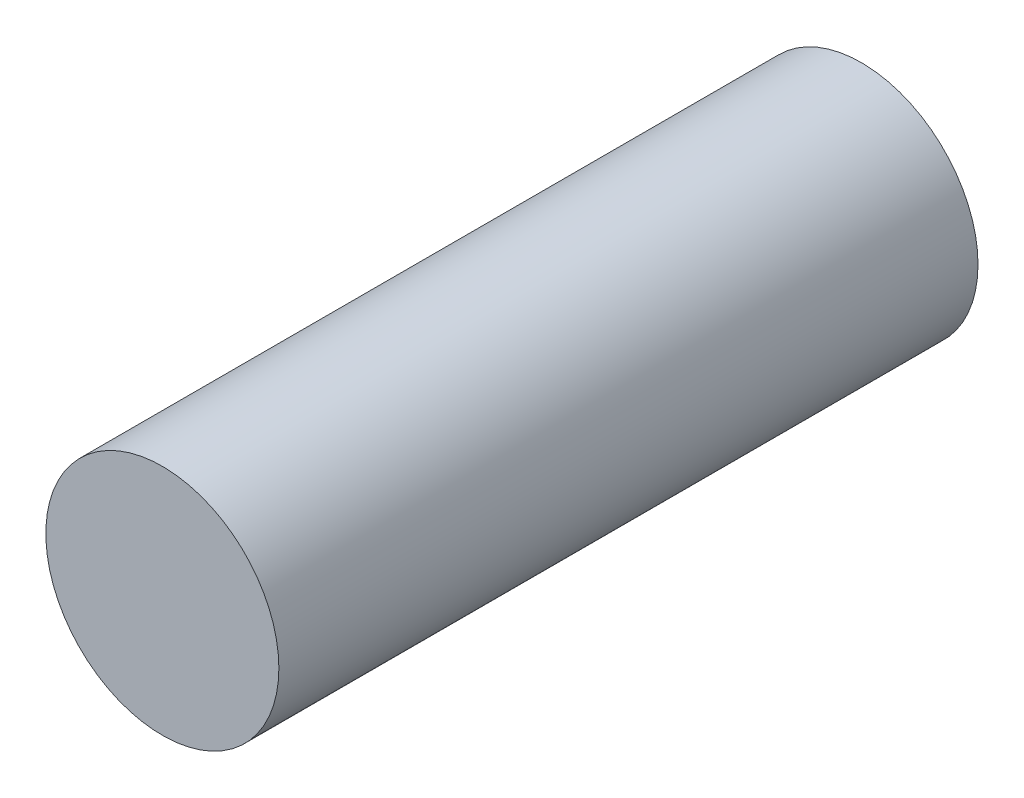
ISO-10303-21;
HEADER;
FILE_DESCRIPTION(('STEP AP214'),'2;1');
FILE_NAME('part.step','',(''),(''),'','','');
FILE_SCHEMA(('AUTOMOTIVE_DESIGN { 1 0 10303 214 1 1 1 1 }'));
ENDSEC;
DATA;
#1=APPLICATION_CONTEXT('core data for automotive mechanical design processes');
#2=APPLICATION_PROTOCOL_DEFINITION('international standard','automotive_design',2000,#1);
#3=PRODUCT_CONTEXT('',#1,'mechanical');
#4=PRODUCT('Part','Part','',(#3));
#5=PRODUCT_RELATED_PRODUCT_CATEGORY('part','',(#4));
#6=PRODUCT_DEFINITION_FORMATION('','',#4);
#7=PRODUCT_DEFINITION_CONTEXT('part definition',#1,'design');
#8=PRODUCT_DEFINITION('design','',#6,#7);
#9=PRODUCT_DEFINITION_SHAPE('','',#8);
#10=(LENGTH_UNIT() NAMED_UNIT(*) SI_UNIT(.MILLI.,.METRE.));
#11=(NAMED_UNIT(*) PLANE_ANGLE_UNIT() SI_UNIT($,.RADIAN.));
#12=(NAMED_UNIT(*) SI_UNIT($,.STERADIAN.) SOLID_ANGLE_UNIT());
#13=UNCERTAINTY_MEASURE_WITH_UNIT(LENGTH_MEASURE(1.E-05),#10,'distance_accuracy_value','');
#14=(GEOMETRIC_REPRESENTATION_CONTEXT(3) GLOBAL_UNCERTAINTY_ASSIGNED_CONTEXT((#13)) GLOBAL_UNIT_ASSIGNED_CONTEXT((#10,
#11,#12)) REPRESENTATION_CONTEXT('',''));
#15=CARTESIAN_POINT('',(0.,0.,0.));
#16=DIRECTION('',(0.,0.,1.));
#17=DIRECTION('',(1.,0.,0.));
#18=AXIS2_PLACEMENT_3D('',#15,#16,#17);
#19=CARTESIAN_POINT('',(0.,0.,75.));
#20=DIRECTION('',(0.,0.,-1.));
#21=DIRECTION('',(-1.,0.,0.));
#22=AXIS2_PLACEMENT_3D('',#19,#20,#21);
#23=CYLINDRICAL_SURFACE('',#22,12.5);
#24=CARTESIAN_POINT('',(0.,0.,75.));
#25=DIRECTION('',(0.,0.,1.));
#26=DIRECTION('',(1.,0.,0.));
#27=AXIS2_PLACEMENT_3D('',#24,#25,#26);
#28=CIRCLE('',#27,12.5);
#29=CARTESIAN_POINT('',(12.5,0.,75.));
#30=VERTEX_POINT('',#29);
#31=EDGE_CURVE('E10',#30,#30,#28,.T.);
#32=ORIENTED_EDGE('',*,*,#31,.F.);
#33=EDGE_LOOP('',(#32));
#34=FACE_BOUND('',#33,.T.);
#35=CARTESIAN_POINT('',(0.,0.,0.));
#36=DIRECTION('',(0.,0.,1.));
#37=DIRECTION('',(1.,0.,0.));
#38=AXIS2_PLACEMENT_3D('',#35,#36,#37);
#39=CIRCLE('',#38,12.5);
#40=CARTESIAN_POINT('',(12.5,0.,0.));
#41=VERTEX_POINT('',#40);
#42=EDGE_CURVE('E34',#41,#41,#39,.T.);
#43=ORIENTED_EDGE('',*,*,#42,.T.);
#44=EDGE_LOOP('',(#43));
#45=FACE_BOUND('',#44,.T.);
#46=ADVANCED_FACE('F31',(#34,#45),#23,.T.);
#47=CARTESIAN_POINT('',(0.,0.,75.));
#48=DIRECTION('',(0.,0.,1.));
#49=DIRECTION('',(1.,0.,0.));
#50=AXIS2_PLACEMENT_3D('',#47,#48,#49);
#51=PLANE('',#50);
#52=ORIENTED_EDGE('',*,*,#31,.T.);
#53=EDGE_LOOP('',(#52));
#54=FACE_BOUND('',#53,.T.);
#55=ADVANCED_FACE('F46',(#54),#51,.T.);
#56=CARTESIAN_POINT('',(0.,0.,0.));
#57=DIRECTION('',(0.,0.,1.));
#58=DIRECTION('',(1.,0.,0.));
#59=AXIS2_PLACEMENT_3D('',#56,#57,#58);
#60=PLANE('',#59);
#61=ORIENTED_EDGE('',*,*,#42,.F.);
#62=EDGE_LOOP('',(#61));
#63=FACE_BOUND('',#62,.T.);
#64=ADVANCED_FACE('F44',(#63),#60,.F.);
#65=CLOSED_SHELL('',(#46,#55,#64));
#66=MANIFOLD_SOLID_BREP('B2',#65);
#67=ADVANCED_BREP_SHAPE_REPRESENTATION('',(#18,#66),#14);
#68=SHAPE_DEFINITION_REPRESENTATION(#9,#67);
ENDSEC;
END-ISO-10303-21;
